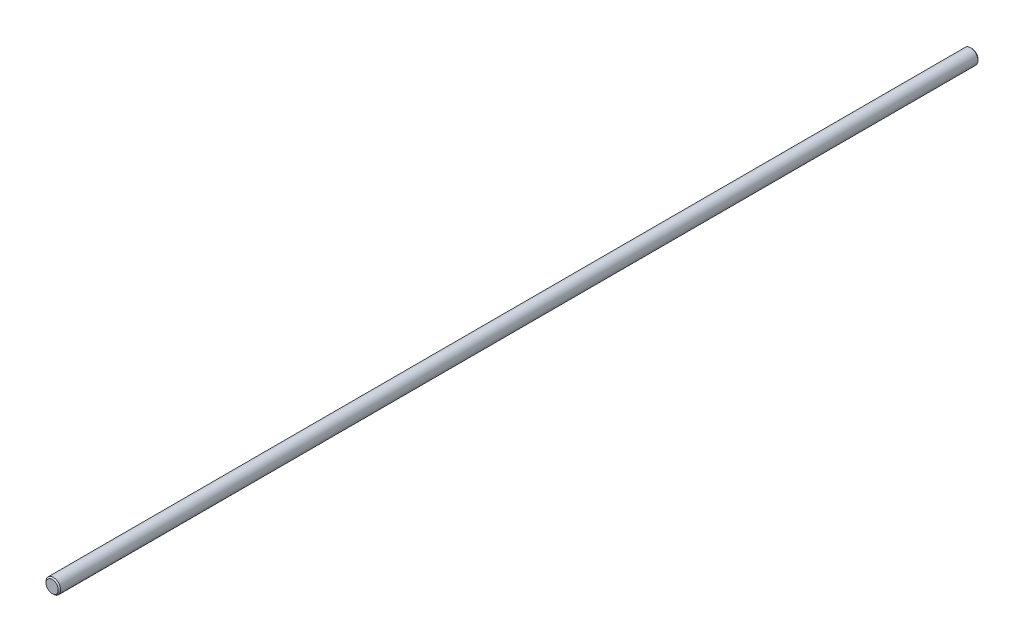
ISO-10303-21;
HEADER;
FILE_DESCRIPTION(('STEP AP214'),'2;1');
FILE_NAME('part.step','',(''),(''),'','','');
FILE_SCHEMA(('AUTOMOTIVE_DESIGN { 1 0 10303 214 1 1 1 1 }'));
ENDSEC;
DATA;
#1=APPLICATION_CONTEXT('core data for automotive mechanical design processes');
#2=APPLICATION_PROTOCOL_DEFINITION('international standard','automotive_design',2000,#1);
#3=PRODUCT_CONTEXT('',#1,'mechanical');
#4=PRODUCT('Part','Part','',(#3));
#5=PRODUCT_RELATED_PRODUCT_CATEGORY('part','',(#4));
#6=PRODUCT_DEFINITION_FORMATION('','',#4);
#7=PRODUCT_DEFINITION_CONTEXT('part definition',#1,'design');
#8=PRODUCT_DEFINITION('design','',#6,#7);
#9=PRODUCT_DEFINITION_SHAPE('','',#8);
#10=(LENGTH_UNIT() NAMED_UNIT(*) SI_UNIT(.MILLI.,.METRE.));
#11=(NAMED_UNIT(*) PLANE_ANGLE_UNIT() SI_UNIT($,.RADIAN.));
#12=(NAMED_UNIT(*) SI_UNIT($,.STERADIAN.) SOLID_ANGLE_UNIT());
#13=UNCERTAINTY_MEASURE_WITH_UNIT(LENGTH_MEASURE(1.E-05),#10,'distance_accuracy_value','');
#14=(GEOMETRIC_REPRESENTATION_CONTEXT(3) GLOBAL_UNCERTAINTY_ASSIGNED_CONTEXT((#13)) GLOBAL_UNIT_ASSIGNED_CONTEXT((#10,
#11,#12)) REPRESENTATION_CONTEXT('',''));
#15=CARTESIAN_POINT('',(0.,0.,0.));
#16=DIRECTION('',(0.,0.,1.));
#17=DIRECTION('',(1.,0.,0.));
#18=AXIS2_PLACEMENT_3D('',#15,#16,#17);
#19=CARTESIAN_POINT('',(0.,0.,-750.));
#20=DIRECTION('',(0.,0.,1.));
#21=DIRECTION('',(1.,0.,0.));
#22=AXIS2_PLACEMENT_3D('',#19,#20,#21);
#23=CYLINDRICAL_SURFACE('',#22,6.);
#24=CARTESIAN_POINT('',(0.,0.,-749.));
#25=DIRECTION('',(0.,0.,1.));
#26=DIRECTION('',(1.,0.,0.));
#27=AXIS2_PLACEMENT_3D('',#24,#25,#26);
#28=CIRCLE('',#27,6.);
#29=CARTESIAN_POINT('',(6.,0.,-749.));
#30=VERTEX_POINT('',#29);
#31=EDGE_CURVE('E53',#30,#30,#28,.T.);
#32=ORIENTED_EDGE('',*,*,#31,.T.);
#33=EDGE_LOOP('',(#32));
#34=FACE_BOUND('',#33,.T.);
#35=CARTESIAN_POINT('',(0.,0.,-1.));
#36=DIRECTION('',(0.,0.,1.));
#37=DIRECTION('',(1.,0.,0.));
#38=AXIS2_PLACEMENT_3D('',#35,#36,#37);
#39=CIRCLE('',#38,6.);
#40=CARTESIAN_POINT('',(6.,0.,-1.));
#41=VERTEX_POINT('',#40);
#42=EDGE_CURVE('E58',#41,#41,#39,.F.);
#43=ORIENTED_EDGE('',*,*,#42,.T.);
#44=EDGE_LOOP('',(#43));
#45=FACE_BOUND('',#44,.T.);
#46=ADVANCED_FACE('F39',(#34,#45),#23,.T.);
#47=CARTESIAN_POINT('',(0.,0.,-750.));
#48=DIRECTION('',(0.,0.,1.));
#49=DIRECTION('',(1.,0.,0.));
#50=AXIS2_PLACEMENT_3D('',#47,#48,#49);
#51=PLANE('',#50);
#52=CARTESIAN_POINT('',(0.,0.,-750.));
#53=DIRECTION('',(0.,0.,1.));
#54=DIRECTION('',(1.,0.,0.));
#55=AXIS2_PLACEMENT_3D('',#52,#53,#54);
#56=CIRCLE('',#55,5.00000000000023);
#57=CARTESIAN_POINT('',(5.00000000000023,0.,-750.));
#58=VERTEX_POINT('',#57);
#59=EDGE_CURVE('E48',#58,#58,#56,.F.);
#60=ORIENTED_EDGE('',*,*,#59,.T.);
#61=EDGE_LOOP('',(#60));
#62=FACE_BOUND('',#61,.T.);
#63=ADVANCED_FACE('F75',(#62),#51,.F.);
#64=CARTESIAN_POINT('',(0.,0.,0.));
#65=DIRECTION('',(0.,0.,1.));
#66=DIRECTION('',(1.,0.,0.));
#67=AXIS2_PLACEMENT_3D('',#64,#65,#66);
#68=PLANE('',#67);
#69=CARTESIAN_POINT('',(0.,0.,0.));
#70=DIRECTION('',(0.,0.,1.));
#71=DIRECTION('',(1.,0.,0.));
#72=AXIS2_PLACEMENT_3D('',#69,#70,#71);
#73=CIRCLE('',#72,5.);
#74=CARTESIAN_POINT('',(5.,0.,0.));
#75=VERTEX_POINT('',#74);
#76=EDGE_CURVE('E10',#75,#75,#73,.T.);
#77=ORIENTED_EDGE('',*,*,#76,.T.);
#78=EDGE_LOOP('',(#77));
#79=FACE_BOUND('',#78,.T.);
#80=ADVANCED_FACE('F72',(#79),#68,.T.);
#81=CARTESIAN_POINT('',(0.,0.,-749.));
#82=DIRECTION('',(0.,0.,1.));
#83=DIRECTION('',(1.,0.,0.));
#84=AXIS2_PLACEMENT_3D('',#81,#82,#83);
#85=CONICAL_SURFACE('',#84,6.,0.785398163397391);
#86=ORIENTED_EDGE('',*,*,#59,.F.);
#87=EDGE_LOOP('',(#86));
#88=FACE_BOUND('',#87,.T.);
#89=ORIENTED_EDGE('',*,*,#31,.F.);
#90=EDGE_LOOP('',(#89));
#91=FACE_BOUND('',#90,.T.);
#92=ADVANCED_FACE('F68',(#88,#91),#85,.T.);
#93=CARTESIAN_POINT('',(0.,0.,0.));
#94=DIRECTION('',(0.,0.,-1.));
#95=DIRECTION('',(-1.,0.,0.));
#96=AXIS2_PLACEMENT_3D('',#93,#94,#95);
#97=CONICAL_SURFACE('',#96,5.,0.785398163397446);
#98=ORIENTED_EDGE('',*,*,#42,.F.);
#99=EDGE_LOOP('',(#98));
#100=FACE_BOUND('',#99,.T.);
#101=ORIENTED_EDGE('',*,*,#76,.F.);
#102=EDGE_LOOP('',(#101));
#103=FACE_BOUND('',#102,.T.);
#104=ADVANCED_FACE('F42',(#100,#103),#97,.T.);
#105=CLOSED_SHELL('',(#46,#63,#80,#92,#104));
#106=MANIFOLD_SOLID_BREP('B2',#105);
#107=ADVANCED_BREP_SHAPE_REPRESENTATION('',(#18,#106),#14);
#108=SHAPE_DEFINITION_REPRESENTATION(#9,#107);
ENDSEC;
END-ISO-10303-21;
